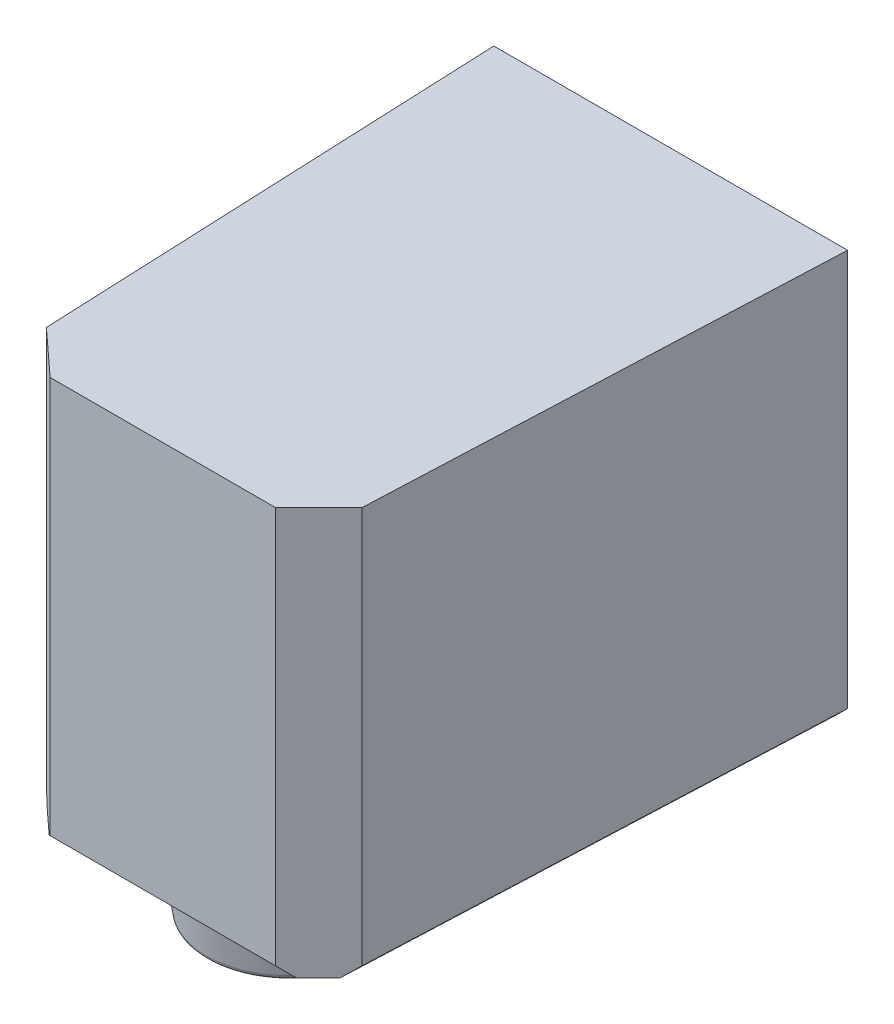
ISO-10303-21;
HEADER;
FILE_DESCRIPTION(('STEP AP214'),'2;1');
FILE_NAME('part.step','',(''),(''),'','','');
FILE_SCHEMA(('AUTOMOTIVE_DESIGN { 1 0 10303 214 1 1 1 1 }'));
ENDSEC;
DATA;
#1=APPLICATION_CONTEXT('core data for automotive mechanical design processes');
#2=APPLICATION_PROTOCOL_DEFINITION('international standard','automotive_design',2000,#1);
#3=PRODUCT_CONTEXT('',#1,'mechanical');
#4=PRODUCT('Part','Part','',(#3));
#5=PRODUCT_RELATED_PRODUCT_CATEGORY('part','',(#4));
#6=PRODUCT_DEFINITION_FORMATION('','',#4);
#7=PRODUCT_DEFINITION_CONTEXT('part definition',#1,'design');
#8=PRODUCT_DEFINITION('design','',#6,#7);
#9=PRODUCT_DEFINITION_SHAPE('','',#8);
#10=(LENGTH_UNIT() NAMED_UNIT(*) SI_UNIT(.MILLI.,.METRE.));
#11=(NAMED_UNIT(*) PLANE_ANGLE_UNIT() SI_UNIT($,.RADIAN.));
#12=(NAMED_UNIT(*) SI_UNIT($,.STERADIAN.) SOLID_ANGLE_UNIT());
#13=UNCERTAINTY_MEASURE_WITH_UNIT(LENGTH_MEASURE(1.E-05),#10,'distance_accuracy_value','');
#14=(GEOMETRIC_REPRESENTATION_CONTEXT(3) GLOBAL_UNCERTAINTY_ASSIGNED_CONTEXT((#13)) GLOBAL_UNIT_ASSIGNED_CONTEXT((#10,
#11,#12)) REPRESENTATION_CONTEXT('',''));
#15=CARTESIAN_POINT('',(0.,0.,0.));
#16=DIRECTION('',(0.,0.,1.));
#17=DIRECTION('',(1.,0.,0.));
#18=AXIS2_PLACEMENT_3D('',#15,#16,#17);
#19=CARTESIAN_POINT('',(4.2,78.5,98.1));
#20=DIRECTION('',(0.999084762033209,0.,-0.0427742711573851));
#21=DIRECTION('',(-0.0427742711573851,0.,-0.99908476203321));
#22=AXIS2_PLACEMENT_3D('',#19,#20,#21);
#23=PLANE('',#22);
#24=DIRECTION('',(0.0427742711573851,0.,0.99908476203321));
#25=VECTOR('',#24,1.);
#26=CARTESIAN_POINT('',(4.2,2.00000000000003,98.1));
#27=LINE('',#26,#25);
#28=CARTESIAN_POINT('',(0.,2.00000000000003,0.));
#29=VERTEX_POINT('',#28);
#30=CARTESIAN_POINT('',(3.85780583074092,2.00000000000003,90.1073219037343));
#31=VERTEX_POINT('',#30);
#32=EDGE_CURVE('E147',#29,#31,#27,.T.);
#33=ORIENTED_EDGE('',*,*,#32,.T.);
#34=DIRECTION('',(0.,1.,0.));
#35=VECTOR('',#34,1.);
#36=CARTESIAN_POINT('',(3.85780583074092,78.5,90.1073219037343));
#37=LINE('',#36,#35);
#38=CARTESIAN_POINT('',(3.85780583074092,78.5,90.1073219037343));
#39=VERTEX_POINT('',#38);
#40=EDGE_CURVE('E181',#31,#39,#37,.T.);
#41=ORIENTED_EDGE('',*,*,#40,.T.);
#42=DIRECTION('',(0.0427742711573851,0.,0.999084762033209));
#43=VECTOR('',#42,1.);
#44=CARTESIAN_POINT('',(4.2,78.5,98.1));
#45=LINE('',#44,#43);
#46=CARTESIAN_POINT('',(0.,78.5,0.));
#47=VERTEX_POINT('',#46);
#48=EDGE_CURVE('E134',#47,#39,#45,.T.);
#49=ORIENTED_EDGE('',*,*,#48,.F.);
#50=DIRECTION('',(0.,-1.,0.));
#51=VECTOR('',#50,1.);
#52=CARTESIAN_POINT('',(0.,78.5,0.));
#53=LINE('',#52,#51);
#54=EDGE_CURVE('E123',#47,#29,#53,.T.);
#55=ORIENTED_EDGE('',*,*,#54,.T.);
#56=EDGE_LOOP('',(#33,#41,#49,#55));
#57=FACE_BOUND('',#56,.T.);
#58=ADVANCED_FACE('F36',(#57),#23,.F.);
#59=CARTESIAN_POINT('',(64.,78.5,98.1));
#60=DIRECTION('',(0.,0.,-1.));
#61=DIRECTION('',(-1.,0.,0.));
#62=AXIS2_PLACEMENT_3D('',#59,#60,#61);
#63=PLANE('',#62);
#64=DIRECTION('',(1.,0.,0.));
#65=VECTOR('',#64,1.);
#66=CARTESIAN_POINT('',(64.,78.5,98.1));
#67=LINE('',#66,#65);
#68=CARTESIAN_POINT('',(12.5654838845,78.5,98.1));
#69=VERTEX_POINT('',#68);
#70=CARTESIAN_POINT('',(56.,78.5,98.1));
#71=VERTEX_POINT('',#70);
#72=EDGE_CURVE('E112',#69,#71,#67,.T.);
#73=ORIENTED_EDGE('',*,*,#72,.F.);
#74=DIRECTION('',(0.,-1.,0.));
#75=VECTOR('',#74,1.);
#76=CARTESIAN_POINT('',(12.5654838845,78.5,98.1));
#77=LINE('',#76,#75);
#78=CARTESIAN_POINT('',(12.5654838845,2.00000000000003,98.1));
#79=VERTEX_POINT('',#78);
#80=EDGE_CURVE('E168',#69,#79,#77,.T.);
#81=ORIENTED_EDGE('',*,*,#80,.T.);
#82=DIRECTION('',(1.,0.,0.));
#83=VECTOR('',#82,1.);
#84=CARTESIAN_POINT('',(64.,2.00000000000003,98.1));
#85=LINE('',#84,#83);
#86=CARTESIAN_POINT('',(56.,2.00000000000003,98.1));
#87=VERTEX_POINT('',#86);
#88=EDGE_CURVE('E162',#79,#87,#85,.T.);
#89=ORIENTED_EDGE('',*,*,#88,.T.);
#90=DIRECTION('',(0.,1.,0.));
#91=VECTOR('',#90,1.);
#92=CARTESIAN_POINT('',(56.,78.5,98.1));
#93=LINE('',#92,#91);
#94=EDGE_CURVE('E166',#87,#71,#93,.T.);
#95=ORIENTED_EDGE('',*,*,#94,.T.);
#96=EDGE_LOOP('',(#73,#81,#89,#95));
#97=FACE_BOUND('',#96,.T.);
#98=ADVANCED_FACE('F209',(#97),#63,.F.);
#99=CARTESIAN_POINT('',(68.2,78.5,0.));
#100=DIRECTION('',(-0.999084762033209,0.,-0.0427742711573851));
#101=DIRECTION('',(-0.0427742711573851,0.,0.99908476203321));
#102=AXIS2_PLACEMENT_3D('',#99,#100,#101);
#103=PLANE('',#102);
#104=DIRECTION('',(0.0427742711573851,0.,-0.999084762033209));
#105=VECTOR('',#104,1.);
#106=CARTESIAN_POINT('',(68.2,78.5,0.));
#107=LINE('',#106,#105);
#108=CARTESIAN_POINT('',(64.3578274760383,78.5,89.7421725239617));
#109=VERTEX_POINT('',#108);
#110=CARTESIAN_POINT('',(68.2,78.5,0.));
#111=VERTEX_POINT('',#110);
#112=EDGE_CURVE('E104',#109,#111,#107,.T.);
#113=ORIENTED_EDGE('',*,*,#112,.F.);
#114=DIRECTION('',(0.,-1.,0.));
#115=VECTOR('',#114,1.);
#116=CARTESIAN_POINT('',(64.3578274760383,78.5,89.7421725239617));
#117=LINE('',#116,#115);
#118=CARTESIAN_POINT('',(64.3578274760383,2.00000000000002,89.7421725239617));
#119=VERTEX_POINT('',#118);
#120=EDGE_CURVE('E44',#109,#119,#117,.T.);
#121=ORIENTED_EDGE('',*,*,#120,.T.);
#122=DIRECTION('',(0.0427742711573851,0.,-0.99908476203321));
#123=VECTOR('',#122,1.);
#124=CARTESIAN_POINT('',(68.2,2.00000000000003,0.));
#125=LINE('',#124,#123);
#126=CARTESIAN_POINT('',(68.2,2.00000000000006,0.));
#127=VERTEX_POINT('',#126);
#128=EDGE_CURVE('E118',#119,#127,#125,.T.);
#129=ORIENTED_EDGE('',*,*,#128,.T.);
#130=DIRECTION('',(0.,-1.,0.));
#131=VECTOR('',#130,1.);
#132=CARTESIAN_POINT('',(68.2,78.5,0.));
#133=LINE('',#132,#131);
#134=EDGE_CURVE('E115',#111,#127,#133,.T.);
#135=ORIENTED_EDGE('',*,*,#134,.F.);
#136=EDGE_LOOP('',(#113,#121,#129,#135));
#137=FACE_BOUND('',#136,.T.);
#138=ADVANCED_FACE('F116',(#137),#103,.F.);
#139=CARTESIAN_POINT('',(0.,78.5,0.));
#140=DIRECTION('',(0.,0.,1.));
#141=DIRECTION('',(1.,0.,0.));
#142=AXIS2_PLACEMENT_3D('',#139,#140,#141);
#143=PLANE('',#142);
#144=DIRECTION('',(-1.,0.,0.));
#145=VECTOR('',#144,1.);
#146=CARTESIAN_POINT('',(0.,0.,0.));
#147=LINE('',#146,#145);
#148=CARTESIAN_POINT('',(66.1981678472106,0.,0.));
#149=VERTEX_POINT('',#148);
#150=CARTESIAN_POINT('',(2.00183215278941,0.,0.));
#151=VERTEX_POINT('',#150);
#152=EDGE_CURVE('E133',#149,#151,#147,.T.);
#153=ORIENTED_EDGE('',*,*,#152,.T.);
#154=DIRECTION('',(-0.707430440678405,0.706782973480232,0.));
#155=VECTOR('',#154,1.);
#156=CARTESIAN_POINT('',(2.10192287927346,-0.0999991196510477,0.));
#157=LINE('',#156,#155);
#158=EDGE_CURVE('E160',#151,#29,#157,.T.);
#159=ORIENTED_EDGE('',*,*,#158,.T.);
#160=ORIENTED_EDGE('',*,*,#54,.F.);
#161=DIRECTION('',(-1.,0.,0.));
#162=VECTOR('',#161,1.);
#163=CARTESIAN_POINT('',(0.,78.5,0.));
#164=LINE('',#163,#162);
#165=EDGE_CURVE('E109',#111,#47,#164,.T.);
#166=ORIENTED_EDGE('',*,*,#165,.F.);
#167=ORIENTED_EDGE('',*,*,#134,.T.);
#168=DIRECTION('',(-0.707430440678405,-0.706782973480232,0.));
#169=VECTOR('',#168,1.);
#170=CARTESIAN_POINT('',(68.2,2.00000000000003,0.));
#171=LINE('',#170,#169);
#172=EDGE_CURVE('E158',#127,#149,#171,.T.);
#173=ORIENTED_EDGE('',*,*,#172,.T.);
#174=EDGE_LOOP('',(#153,#159,#160,#166,#167,#173));
#175=FACE_BOUND('',#174,.T.);
#176=ADVANCED_FACE('F126',(#175),#143,.F.);
#177=CARTESIAN_POINT('',(0.,78.5,0.));
#178=DIRECTION('',(0.,-1.,0.));
#179=DIRECTION('',(0.,0.,-1.));
#180=AXIS2_PLACEMENT_3D('',#177,#178,#179);
#181=PLANE('',#180);
#182=ORIENTED_EDGE('',*,*,#48,.T.);
#183=DIRECTION('',(-0.736705587409528,0.,-0.676213633018133));
#184=VECTOR('',#183,1.);
#185=CARTESIAN_POINT('',(12.5654838845,78.5,98.1));
#186=LINE('',#185,#184);
#187=EDGE_CURVE('E184',#39,#69,#186,.F.);
#188=ORIENTED_EDGE('',*,*,#187,.T.);
#189=ORIENTED_EDGE('',*,*,#72,.T.);
#190=DIRECTION('',(-0.707106781186549,0.,0.707106781186546));
#191=VECTOR('',#190,1.);
#192=CARTESIAN_POINT('',(64.3578274760383,78.5,89.7421725239617));
#193=LINE('',#192,#191);
#194=EDGE_CURVE('E57',#71,#109,#193,.F.);
#195=ORIENTED_EDGE('',*,*,#194,.T.);
#196=ORIENTED_EDGE('',*,*,#112,.T.);
#197=ORIENTED_EDGE('',*,*,#165,.T.);
#198=EDGE_LOOP('',(#182,#188,#189,#195,#196,#197));
#199=FACE_BOUND('',#198,.T.);
#200=ADVANCED_FACE('F107',(#199),#181,.F.);
#201=CARTESIAN_POINT('',(0.,0.,0.));
#202=DIRECTION('',(0.,-1.,0.));
#203=DIRECTION('',(0.,0.,-1.));
#204=AXIS2_PLACEMENT_3D('',#201,#202,#203);
#205=PLANE('',#204);
#206=CARTESIAN_POINT('',(34.1,0.,73.6));
#207=DIRECTION('',(0.,-1.,0.));
#208=DIRECTION('',(0.,0.,-1.));
#209=AXIS2_PLACEMENT_3D('',#206,#207,#208);
#210=CIRCLE('',#209,18.3692867378162);
#211=CARTESIAN_POINT('',(34.1,0.,55.2307132621838));
#212=VERTEX_POINT('',#211);
#213=EDGE_CURVE('E144',#212,#212,#210,.F.);
#214=ORIENTED_EDGE('',*,*,#213,.T.);
#215=EDGE_LOOP('',(#214));
#216=FACE_BOUND('',#215,.T.);
#217=DIRECTION('',(-1.,0.,0.));
#218=VECTOR('',#217,1.);
#219=CARTESIAN_POINT('',(4.2,0.,96.1));
#220=LINE('',#219,#218);
#221=CARTESIAN_POINT('',(58.,0.,96.1));
#222=VERTEX_POINT('',#221);
#223=CARTESIAN_POINT('',(10.3865701464808,0.,96.1));
#224=VERTEX_POINT('',#223);
#225=EDGE_CURVE('E153',#222,#224,#220,.T.);
#226=ORIENTED_EDGE('',*,*,#225,.T.);
#227=DIRECTION('',(0.736705587409528,0.,0.676213633018133));
#228=VECTOR('',#227,1.);
#229=CARTESIAN_POINT('',(-43.1247580364967,0.,46.9825638672375));
#230=LINE('',#229,#228);
#231=CARTESIAN_POINT('',(5.94152389712215,0.,92.019942885486));
#232=VERTEX_POINT('',#231);
#233=EDGE_CURVE('E177',#224,#232,#230,.F.);
#234=ORIENTED_EDGE('',*,*,#233,.T.);
#235=DIRECTION('',(-0.0427742711573851,0.,-0.99908476203321));
#236=VECTOR('',#235,1.);
#237=CARTESIAN_POINT('',(1.99816952406645,0.,-0.0855485423147716));
#238=LINE('',#237,#236);
#239=EDGE_CURVE('E156',#232,#151,#238,.T.);
#240=ORIENTED_EDGE('',*,*,#239,.T.);
#241=ORIENTED_EDGE('',*,*,#152,.F.);
#242=DIRECTION('',(-0.0427742711573851,0.,0.99908476203321));
#243=VECTOR('',#242,1.);
#244=CARTESIAN_POINT('',(62.0018304759336,0.,98.0144514576852));
#245=LINE('',#244,#243);
#246=CARTESIAN_POINT('',(62.2664565049133,0.,91.8335434950867));
#247=VERTEX_POINT('',#246);
#248=EDGE_CURVE('E150',#149,#247,#245,.T.);
#249=ORIENTED_EDGE('',*,*,#248,.T.);
#250=DIRECTION('',(0.707106781186549,0.,-0.707106781186546));
#251=VECTOR('',#250,1.);
#252=CARTESIAN_POINT('',(77.0499999999999,0.,77.0500000000002));
#253=LINE('',#252,#251);
#254=EDGE_CURVE('E175',#247,#222,#253,.F.);
#255=ORIENTED_EDGE('',*,*,#254,.T.);
#256=EDGE_LOOP('',(#226,#234,#240,#241,#249,#255));
#257=FACE_BOUND('',#256,.T.);
#258=ADVANCED_FACE('F191',(#216,#257),#205,.T.);
#259=CARTESIAN_POINT('',(34.1,0.,73.6));
#260=DIRECTION('',(0.,1.,0.));
#261=DIRECTION('',(0.,0.,-1.));
#262=AXIS2_PLACEMENT_3D('',#259,#260,#261);
#263=CONICAL_SURFACE('',#262,17.5,0.139626340159546);
#264=CARTESIAN_POINT('',(34.1,-0.860826899039935,73.6));
#265=DIRECTION('',(0.,-1.,0.));
#266=DIRECTION('',(0.,0.,-1.));
#267=AXIS2_PLACEMENT_3D('',#264,#265,#266);
#268=CIRCLE('',#267,17.3790186690747);
#269=CARTESIAN_POINT('',(34.1,-0.860826899039935,56.2209813309253));
#270=VERTEX_POINT('',#269);
#271=EDGE_CURVE('E141',#270,#270,#268,.T.);
#272=ORIENTED_EDGE('',*,*,#271,.T.);
#273=EDGE_LOOP('',(#272));
#274=FACE_BOUND('',#273,.T.);
#275=CARTESIAN_POINT('',(34.1,-11.6391731009601,73.6));
#276=DIRECTION('',(0.,1.,0.));
#277=DIRECTION('',(0.,0.,1.));
#278=AXIS2_PLACEMENT_3D('',#275,#276,#277);
#279=CIRCLE('',#278,15.8642208971454);
#280=CARTESIAN_POINT('',(34.1,-11.6391731009601,89.4642208971455));
#281=VERTEX_POINT('',#280);
#282=EDGE_CURVE('E138',#281,#281,#279,.T.);
#283=ORIENTED_EDGE('',*,*,#282,.T.);
#284=EDGE_LOOP('',(#283));
#285=FACE_BOUND('',#284,.T.);
#286=ADVANCED_FACE('F244',(#274,#285),#263,.T.);
#287=CARTESIAN_POINT('',(34.1,-12.5,73.6));
#288=DIRECTION('',(0.,-1.,0.));
#289=DIRECTION('',(0.,0.,-1.));
#290=AXIS2_PLACEMENT_3D('',#287,#288,#289);
#291=PLANE('',#290);
#292=CARTESIAN_POINT('',(34.1,-12.5,73.6));
#293=DIRECTION('',(0.,-1.,0.));
#294=DIRECTION('',(0.,0.,-1.));
#295=AXIS2_PLACEMENT_3D('',#292,#293,#294);
#296=CIRCLE('',#295,14.8739528284039);
#297=CARTESIAN_POINT('',(34.1,-12.5,58.7260471715961));
#298=VERTEX_POINT('',#297);
#299=EDGE_CURVE('E122',#298,#298,#296,.T.);
#300=ORIENTED_EDGE('',*,*,#299,.T.);
#301=EDGE_LOOP('',(#300));
#302=FACE_BOUND('',#301,.T.);
#303=ADVANCED_FACE('F234',(#302),#291,.T.);
#304=CARTESIAN_POINT('',(34.1,-11.5,73.6));
#305=DIRECTION('',(0.,-1.,0.));
#306=DIRECTION('',(0.,0.,-1.));
#307=AXIS2_PLACEMENT_3D('',#304,#305,#306);
#308=TOROIDAL_SURFACE('',#307,14.8739528284039,1.);
#309=ORIENTED_EDGE('',*,*,#282,.F.);
#310=EDGE_LOOP('',(#309));
#311=FACE_BOUND('',#310,.T.);
#312=ORIENTED_EDGE('',*,*,#299,.F.);
#313=EDGE_LOOP('',(#312));
#314=FACE_BOUND('',#313,.T.);
#315=ADVANCED_FACE('F231',(#311,#314),#308,.T.);
#316=CARTESIAN_POINT('',(34.1,-1.,73.6));
#317=DIRECTION('',(0.,-1.,0.));
#318=DIRECTION('',(0.,0.,-1.));
#319=AXIS2_PLACEMENT_3D('',#316,#317,#318);
#320=TOROIDAL_SURFACE('',#319,18.3692867378162,1.);
#321=ORIENTED_EDGE('',*,*,#213,.F.);
#322=EDGE_LOOP('',(#321));
#323=FACE_BOUND('',#322,.T.);
#324=ORIENTED_EDGE('',*,*,#271,.F.);
#325=EDGE_LOOP('',(#324));
#326=FACE_BOUND('',#325,.T.);
#327=ADVANCED_FACE('F221',(#323,#326),#320,.F.);
#328=CARTESIAN_POINT('',(68.2,2.00000000000003,0.));
#329=DIRECTION('',(0.70645961021383,-0.707106781186548,0.0302459771956991));
#330=DIRECTION('',(-0.0427742711573851,0.,0.99908476203321));
#331=AXIS2_PLACEMENT_3D('',#328,#329,#330);
#332=PLANE('',#331);
#333=ORIENTED_EDGE('',*,*,#128,.F.);
#334=DIRECTION('',(0.585754661256783,0.560163327639276,-0.58575466125678));
#335=VECTOR('',#334,1.);
#336=CARTESIAN_POINT('',(96.4674138985776,32.7067343535582,57.6325861014226));
#337=LINE('',#336,#335);
#338=EDGE_CURVE('E11',#119,#247,#337,.F.);
#339=ORIENTED_EDGE('',*,*,#338,.T.);
#340=ORIENTED_EDGE('',*,*,#248,.F.);
#341=ORIENTED_EDGE('',*,*,#172,.F.);
#342=EDGE_LOOP('',(#333,#339,#340,#341));
#343=FACE_BOUND('',#342,.T.);
#344=ADVANCED_FACE('F186',(#343),#332,.T.);
#345=CARTESIAN_POINT('',(64.,2.00000000000003,98.1));
#346=DIRECTION('',(0.,-0.707106781186547,0.707106781186547));
#347=DIRECTION('',(-1.,0.,0.));
#348=AXIS2_PLACEMENT_3D('',#345,#346,#347);
#349=PLANE('',#348);
#350=ORIENTED_EDGE('',*,*,#88,.F.);
#351=DIRECTION('',(0.610273785063873,0.560163327639276,0.560163327639276));
#352=VECTOR('',#351,1.);
#353=CARTESIAN_POINT('',(31.721451229301,19.5830433399494,115.683043339949));
#354=LINE('',#353,#352);
#355=EDGE_CURVE('E173',#79,#224,#354,.F.);
#356=ORIENTED_EDGE('',*,*,#355,.T.);
#357=ORIENTED_EDGE('',*,*,#225,.F.);
#358=DIRECTION('',(0.577350269189627,-0.577350269189625,-0.577350269189625));
#359=VECTOR('',#358,1.);
#360=CARTESIAN_POINT('',(58.6666666666667,-0.66666666666665,95.4333333333333));
#361=LINE('',#360,#359);
#362=EDGE_CURVE('E171',#222,#87,#361,.F.);
#363=ORIENTED_EDGE('',*,*,#362,.T.);
#364=EDGE_LOOP('',(#350,#356,#357,#363));
#365=FACE_BOUND('',#364,.T.);
#366=ADVANCED_FACE('F212',(#365),#349,.T.);
#367=CARTESIAN_POINT('',(4.2,2.00000000000003,98.1));
#368=DIRECTION('',(-0.70645961021383,-0.707106781186548,0.0302459771956991));
#369=DIRECTION('',(-0.0427742711573851,0.,-0.99908476203321));
#370=AXIS2_PLACEMENT_3D('',#367,#368,#369);
#371=PLANE('',#370);
#372=ORIENTED_EDGE('',*,*,#239,.F.);
#373=DIRECTION('',(0.601517593270232,-0.577350269189625,0.552126119336022));
#374=VECTOR('',#373,1.);
#375=CARTESIAN_POINT('',(6.63609658591585,-0.666666666666646,92.6574832127365));
#376=LINE('',#375,#374);
#377=EDGE_CURVE('E179',#232,#31,#376,.F.);
#378=ORIENTED_EDGE('',*,*,#377,.T.);
#379=ORIENTED_EDGE('',*,*,#32,.F.);
#380=ORIENTED_EDGE('',*,*,#158,.F.);
#381=EDGE_LOOP('',(#372,#378,#379,#380));
#382=FACE_BOUND('',#381,.T.);
#383=ADVANCED_FACE('F196',(#382),#371,.T.);
#384=CARTESIAN_POINT('',(12.5654838845,78.5,98.1));
#385=DIRECTION('',(0.676213633018133,0.,-0.736705587409528));
#386=DIRECTION('',(0.,-1.,0.));
#387=AXIS2_PLACEMENT_3D('',#384,#385,#386);
#388=PLANE('',#387);
#389=ORIENTED_EDGE('',*,*,#187,.F.);
#390=ORIENTED_EDGE('',*,*,#40,.F.);
#391=ORIENTED_EDGE('',*,*,#377,.F.);
#392=ORIENTED_EDGE('',*,*,#233,.F.);
#393=ORIENTED_EDGE('',*,*,#355,.F.);
#394=ORIENTED_EDGE('',*,*,#80,.F.);
#395=EDGE_LOOP('',(#389,#390,#391,#392,#393,#394));
#396=FACE_BOUND('',#395,.T.);
#397=ADVANCED_FACE('F201',(#396),#388,.F.);
#398=CARTESIAN_POINT('',(64.3578274760383,78.5,89.7421725239617));
#399=DIRECTION('',(-0.707106781186546,0.,-0.707106781186549));
#400=DIRECTION('',(0.,-1.,0.));
#401=AXIS2_PLACEMENT_3D('',#398,#399,#400);
#402=PLANE('',#401);
#403=ORIENTED_EDGE('',*,*,#194,.F.);
#404=ORIENTED_EDGE('',*,*,#94,.F.);
#405=ORIENTED_EDGE('',*,*,#362,.F.);
#406=ORIENTED_EDGE('',*,*,#254,.F.);
#407=ORIENTED_EDGE('',*,*,#338,.F.);
#408=ORIENTED_EDGE('',*,*,#120,.F.);
#409=EDGE_LOOP('',(#403,#404,#405,#406,#407,#408));
#410=FACE_BOUND('',#409,.T.);
#411=ADVANCED_FACE('F38',(#410),#402,.F.);
#412=CLOSED_SHELL('',(#58,#98,#138,#176,#200,#258,#286,#303,#315,#327,#344,#366,#383,#397,#411));
#413=MANIFOLD_SOLID_BREP('B2',#412);
#414=ADVANCED_BREP_SHAPE_REPRESENTATION('',(#18,#413),#14);
#415=SHAPE_DEFINITION_REPRESENTATION(#9,#414);
ENDSEC;
END-ISO-10303-21;
